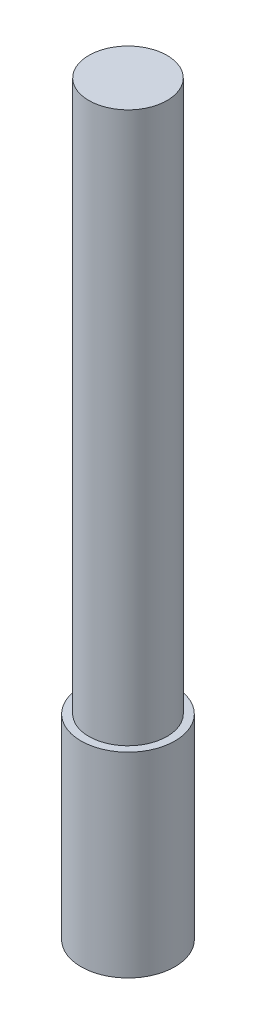
ISO-10303-21;
HEADER;
FILE_DESCRIPTION(('STEP AP214'),'2;1');
FILE_NAME('part.step','',(''),(''),'','','');
FILE_SCHEMA(('AUTOMOTIVE_DESIGN { 1 0 10303 214 1 1 1 1 }'));
ENDSEC;
DATA;
#1=APPLICATION_CONTEXT('core data for automotive mechanical design processes');
#2=APPLICATION_PROTOCOL_DEFINITION('international standard','automotive_design',2000,#1);
#3=PRODUCT_CONTEXT('',#1,'mechanical');
#4=PRODUCT('Part','Part','',(#3));
#5=PRODUCT_RELATED_PRODUCT_CATEGORY('part','',(#4));
#6=PRODUCT_DEFINITION_FORMATION('','',#4);
#7=PRODUCT_DEFINITION_CONTEXT('part definition',#1,'design');
#8=PRODUCT_DEFINITION('design','',#6,#7);
#9=PRODUCT_DEFINITION_SHAPE('','',#8);
#10=(LENGTH_UNIT() NAMED_UNIT(*) SI_UNIT(.MILLI.,.METRE.));
#11=(NAMED_UNIT(*) PLANE_ANGLE_UNIT() SI_UNIT($,.RADIAN.));
#12=(NAMED_UNIT(*) SI_UNIT($,.STERADIAN.) SOLID_ANGLE_UNIT());
#13=UNCERTAINTY_MEASURE_WITH_UNIT(LENGTH_MEASURE(1.E-05),#10,'distance_accuracy_value','');
#14=(GEOMETRIC_REPRESENTATION_CONTEXT(3) GLOBAL_UNCERTAINTY_ASSIGNED_CONTEXT((#13)) GLOBAL_UNIT_ASSIGNED_CONTEXT((#10,
#11,#12)) REPRESENTATION_CONTEXT('',''));
#15=CARTESIAN_POINT('',(0.,0.,0.));
#16=DIRECTION('',(0.,0.,1.));
#17=DIRECTION('',(1.,0.,0.));
#18=AXIS2_PLACEMENT_3D('',#15,#16,#17);
#19=CARTESIAN_POINT('',(0.,95.4,0.));
#20=DIRECTION('',(0.,1.,0.));
#21=DIRECTION('',(1.,0.,0.));
#22=AXIS2_PLACEMENT_3D('',#19,#20,#21);
#23=PLANE('',#22);
#24=CARTESIAN_POINT('',(0.,95.4,0.));
#25=DIRECTION('',(0.,1.,0.));
#26=DIRECTION('',(0.,0.,1.));
#27=AXIS2_PLACEMENT_3D('',#24,#25,#26);
#28=CIRCLE('',#27,5.);
#29=CARTESIAN_POINT('',(0.,95.4,5.));
#30=VERTEX_POINT('',#29);
#31=EDGE_CURVE('E11',#30,#30,#28,.T.);
#32=ORIENTED_EDGE('',*,*,#31,.T.);
#33=EDGE_LOOP('',(#32));
#34=FACE_BOUND('',#33,.T.);
#35=ADVANCED_FACE('F17',(#34),#23,.T.);
#36=CARTESIAN_POINT('',(0.,95.4,0.));
#37=DIRECTION('',(0.,-1.,0.));
#38=DIRECTION('',(0.,0.,-1.));
#39=AXIS2_PLACEMENT_3D('',#36,#37,#38);
#40=CYLINDRICAL_SURFACE('',#39,5.);
#41=ORIENTED_EDGE('',*,*,#31,.F.);
#42=EDGE_LOOP('',(#41));
#43=FACE_BOUND('',#42,.T.);
#44=CARTESIAN_POINT('',(0.,25.,0.));
#45=DIRECTION('',(0.,1.,0.));
#46=DIRECTION('',(0.,0.,1.));
#47=AXIS2_PLACEMENT_3D('',#44,#45,#46);
#48=CIRCLE('',#47,5.);
#49=CARTESIAN_POINT('',(0.,25.,5.));
#50=VERTEX_POINT('',#49);
#51=EDGE_CURVE('E25',#50,#50,#48,.T.);
#52=ORIENTED_EDGE('',*,*,#51,.T.);
#53=EDGE_LOOP('',(#52));
#54=FACE_BOUND('',#53,.T.);
#55=ADVANCED_FACE('F112',(#43,#54),#40,.T.);
#56=CARTESIAN_POINT('',(0.,0.,0.));
#57=DIRECTION('',(0.,1.,0.));
#58=DIRECTION('',(1.,0.,0.));
#59=AXIS2_PLACEMENT_3D('',#56,#57,#58);
#60=PLANE('',#59);
#61=CARTESIAN_POINT('',(0.,0.,0.));
#62=DIRECTION('',(0.,1.,0.));
#63=DIRECTION('',(0.,0.,1.));
#64=AXIS2_PLACEMENT_3D('',#61,#62,#63);
#65=CIRCLE('',#64,6.);
#66=CARTESIAN_POINT('',(0.,0.,6.));
#67=VERTEX_POINT('',#66);
#68=EDGE_CURVE('E53',#67,#67,#65,.T.);
#69=ORIENTED_EDGE('',*,*,#68,.F.);
#70=EDGE_LOOP('',(#69));
#71=FACE_BOUND('',#70,.T.);
#72=ADVANCED_FACE('F103',(#71),#60,.F.);
#73=CARTESIAN_POINT('',(0.,25.,0.));
#74=DIRECTION('',(0.,1.,0.));
#75=DIRECTION('',(1.,0.,0.));
#76=AXIS2_PLACEMENT_3D('',#73,#74,#75);
#77=PLANE('',#76);
#78=ORIENTED_EDGE('',*,*,#51,.F.);
#79=EDGE_LOOP('',(#78));
#80=FACE_BOUND('',#79,.T.);
#81=CARTESIAN_POINT('',(0.,25.,0.));
#82=DIRECTION('',(0.,1.,0.));
#83=DIRECTION('',(0.,0.,1.));
#84=AXIS2_PLACEMENT_3D('',#81,#82,#83);
#85=CIRCLE('',#84,6.);
#86=CARTESIAN_POINT('',(0.,25.,6.));
#87=VERTEX_POINT('',#86);
#88=EDGE_CURVE('E57',#87,#87,#85,.T.);
#89=ORIENTED_EDGE('',*,*,#88,.T.);
#90=EDGE_LOOP('',(#89));
#91=FACE_BOUND('',#90,.T.);
#92=ADVANCED_FACE('F95',(#80,#91),#77,.T.);
#93=CARTESIAN_POINT('',(0.,25.,0.));
#94=DIRECTION('',(0.,-1.,0.));
#95=DIRECTION('',(0.,0.,-1.));
#96=AXIS2_PLACEMENT_3D('',#93,#94,#95);
#97=CYLINDRICAL_SURFACE('',#96,6.);
#98=ORIENTED_EDGE('',*,*,#88,.F.);
#99=EDGE_LOOP('',(#98));
#100=FACE_BOUND('',#99,.T.);
#101=ORIENTED_EDGE('',*,*,#68,.T.);
#102=EDGE_LOOP('',(#101));
#103=FACE_BOUND('',#102,.T.);
#104=ADVANCED_FACE('F54',(#100,#103),#97,.T.);
#105=CLOSED_SHELL('',(#35,#55,#72,#92,#104));
#106=MANIFOLD_SOLID_BREP('B1',#105);
#107=ADVANCED_BREP_SHAPE_REPRESENTATION('',(#18,#106),#14);
#108=SHAPE_DEFINITION_REPRESENTATION(#9,#107);
ENDSEC;
END-ISO-10303-21;
